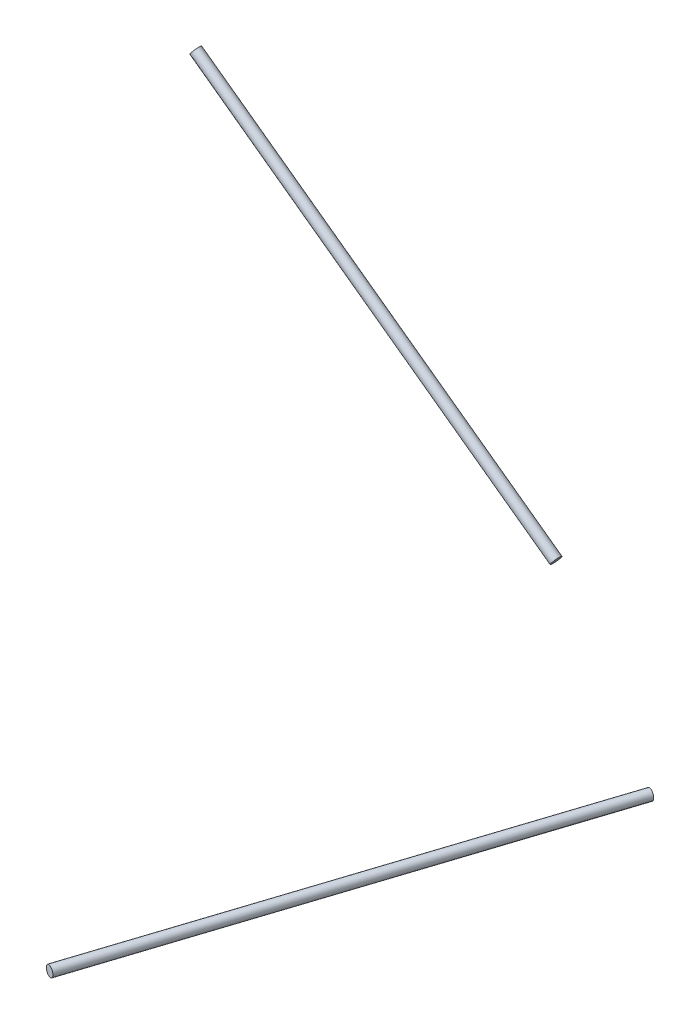
ISO-10303-21;
HEADER;
FILE_DESCRIPTION(('STEP AP214'),'2;1');
FILE_NAME('part.step','',(''),(''),'','','');
FILE_SCHEMA(('AUTOMOTIVE_DESIGN { 1 0 10303 214 1 1 1 1 }'));
ENDSEC;
DATA;
#1=APPLICATION_CONTEXT('core data for automotive mechanical design processes');
#2=APPLICATION_PROTOCOL_DEFINITION('international standard','automotive_design',2000,#1);
#3=PRODUCT_CONTEXT('',#1,'mechanical');
#4=PRODUCT('Part','Part','',(#3));
#5=PRODUCT_RELATED_PRODUCT_CATEGORY('part','',(#4));
#6=PRODUCT_DEFINITION_FORMATION('','',#4);
#7=PRODUCT_DEFINITION_CONTEXT('part definition',#1,'design');
#8=PRODUCT_DEFINITION('design','',#6,#7);
#9=PRODUCT_DEFINITION_SHAPE('','',#8);
#10=(LENGTH_UNIT() NAMED_UNIT(*) SI_UNIT(.MILLI.,.METRE.));
#11=(NAMED_UNIT(*) PLANE_ANGLE_UNIT() SI_UNIT($,.RADIAN.));
#12=(NAMED_UNIT(*) SI_UNIT($,.STERADIAN.) SOLID_ANGLE_UNIT());
#13=UNCERTAINTY_MEASURE_WITH_UNIT(LENGTH_MEASURE(1.E-05),#10,'distance_accuracy_value','');
#14=(GEOMETRIC_REPRESENTATION_CONTEXT(3) GLOBAL_UNCERTAINTY_ASSIGNED_CONTEXT((#13)) GLOBAL_UNIT_ASSIGNED_CONTEXT((#10,
#11,#12)) REPRESENTATION_CONTEXT('',''));
#15=CARTESIAN_POINT('',(0.,0.,0.));
#16=DIRECTION('',(0.,0.,1.));
#17=DIRECTION('',(1.,0.,0.));
#18=AXIS2_PLACEMENT_3D('',#15,#16,#17);
#19=CARTESIAN_POINT('',(74.3249683997209,0.,44.5903652225247));
#20=DIRECTION('',(0.309016994374937,0.,-0.951056516295157));
#21=DIRECTION('',(-0.951056516295157,0.,-0.309016994374937));
#22=AXIS2_PLACEMENT_3D('',#19,#20,#21);
#23=PLANE('',#22);
#24=CARTESIAN_POINT('',(74.3249683997209,0.,44.5903652225247));
#25=DIRECTION('',(0.309016994374937,0.,-0.951056516295157));
#26=DIRECTION('',(-0.951056516295157,0.,-0.309016994374937));
#27=AXIS2_PLACEMENT_3D('',#24,#25,#26);
#28=CIRCLE('',#27,1.49999999999999);
#29=CARTESIAN_POINT('',(72.8983836252782,0.,44.1268397309623));
#30=VERTEX_POINT('',#29);
#31=EDGE_CURVE('E47',#30,#30,#28,.T.);
#32=ORIENTED_EDGE('',*,*,#31,.F.);
#33=EDGE_LOOP('',(#32));
#34=FACE_BOUND('',#33,.T.);
#35=ADVANCED_FACE('F41',(#34),#23,.F.);
#36=CARTESIAN_POINT('',(117.688753794732,0.,-88.8696431973082));
#37=DIRECTION('',(0.309016994374937,0.,-0.951056516295157));
#38=DIRECTION('',(-0.951056516295157,0.,-0.309016994374937));
#39=AXIS2_PLACEMENT_3D('',#36,#37,#38);
#40=PLANE('',#39);
#41=CARTESIAN_POINT('',(117.688753794732,0.,-88.8696431973082));
#42=DIRECTION('',(0.309016994374937,0.,-0.951056516295157));
#43=DIRECTION('',(-0.951056516295157,0.,-0.309016994374937));
#44=AXIS2_PLACEMENT_3D('',#41,#42,#43);
#45=CIRCLE('',#44,1.49999999999999);
#46=CARTESIAN_POINT('',(116.26216902029,0.,-89.3331686888706));
#47=VERTEX_POINT('',#46);
#48=EDGE_CURVE('E11',#47,#47,#45,.T.);
#49=ORIENTED_EDGE('',*,*,#48,.T.);
#50=EDGE_LOOP('',(#49));
#51=FACE_BOUND('',#50,.T.);
#52=ADVANCED_FACE('F56',(#51),#40,.T.);
#53=CARTESIAN_POINT('',(74.3249683997209,0.,44.5903652225247));
#54=DIRECTION('',(0.309016994374937,0.,-0.951056516295157));
#55=DIRECTION('',(-0.951056516295157,0.,-0.309016994374937));
#56=AXIS2_PLACEMENT_3D('',#53,#54,#55);
#57=CYLINDRICAL_SURFACE('',#56,1.49999999999999);
#58=ORIENTED_EDGE('',*,*,#48,.F.);
#59=EDGE_LOOP('',(#58));
#60=FACE_BOUND('',#59,.T.);
#61=ORIENTED_EDGE('',*,*,#31,.T.);
#62=EDGE_LOOP('',(#61));
#63=FACE_BOUND('',#62,.T.);
#64=ADVANCED_FACE('F53',(#60,#63),#57,.T.);
#65=CLOSED_SHELL('',(#35,#52,#64));
#66=MANIFOLD_SOLID_BREP('B2',#65);
#67=CARTESIAN_POINT('',(178.792755756863,134.602822774976,0.));
#68=DIRECTION('',(-0.809016994374947,0.587785252292474,0.));
#69=DIRECTION('',(-0.587785252292474,-0.809016994374947,0.));
#70=AXIS2_PLACEMENT_3D('',#67,#68,#69);
#71=PLANE('',#70);
#72=CARTESIAN_POINT('',(178.792755756863,134.602822774976,0.));
#73=DIRECTION('',(-0.809016994374947,0.587785252292474,0.));
#74=DIRECTION('',(-0.587785252292474,-0.809016994374947,0.));
#75=AXIS2_PLACEMENT_3D('',#72,#73,#74);
#76=CIRCLE('',#75,1.5);
#77=CARTESIAN_POINT('',(177.911077878425,133.389297283414,0.));
#78=VERTEX_POINT('',#77);
#79=EDGE_CURVE('E87',#78,#78,#76,.T.);
#80=ORIENTED_EDGE('',*,*,#79,.F.);
#81=EDGE_LOOP('',(#80));
#82=FACE_BOUND('',#81,.T.);
#83=ADVANCED_FACE('F81',(#82),#71,.F.);
#84=CARTESIAN_POINT('',(72.764891711863,211.63657515724,0.));
#85=DIRECTION('',(-0.809016994374947,0.587785252292474,0.));
#86=DIRECTION('',(-0.587785252292474,-0.809016994374947,0.));
#87=AXIS2_PLACEMENT_3D('',#84,#85,#86);
#88=PLANE('',#87);
#89=CARTESIAN_POINT('',(72.764891711863,211.63657515724,0.));
#90=DIRECTION('',(-0.809016994374947,0.587785252292474,0.));
#91=DIRECTION('',(-0.587785252292474,-0.809016994374947,0.));
#92=AXIS2_PLACEMENT_3D('',#89,#90,#91);
#93=CIRCLE('',#92,1.5);
#94=CARTESIAN_POINT('',(71.8832138334243,210.423049665677,0.));
#95=VERTEX_POINT('',#94);
#96=EDGE_CURVE('E40',#95,#95,#93,.T.);
#97=ORIENTED_EDGE('',*,*,#96,.T.);
#98=EDGE_LOOP('',(#97));
#99=FACE_BOUND('',#98,.T.);
#100=ADVANCED_FACE('F96',(#99),#88,.T.);
#101=CARTESIAN_POINT('',(178.792755756863,134.602822774976,0.));
#102=DIRECTION('',(-0.809016994374948,0.587785252292473,0.));
#103=DIRECTION('',(-0.587785252292473,-0.809016994374948,0.));
#104=AXIS2_PLACEMENT_3D('',#101,#102,#103);
#105=CYLINDRICAL_SURFACE('',#104,1.5);
#106=ORIENTED_EDGE('',*,*,#96,.F.);
#107=EDGE_LOOP('',(#106));
#108=FACE_BOUND('',#107,.T.);
#109=ORIENTED_EDGE('',*,*,#79,.T.);
#110=EDGE_LOOP('',(#109));
#111=FACE_BOUND('',#110,.T.);
#112=ADVANCED_FACE('F93',(#108,#111),#105,.T.);
#113=CLOSED_SHELL('',(#83,#100,#112));
#114=MANIFOLD_SOLID_BREP('B6_NOT_SHOWN',#113);
#115=ADVANCED_BREP_SHAPE_REPRESENTATION('',(#18,#66,#114),#14);
#116=SHAPE_DEFINITION_REPRESENTATION(#9,#115);
ENDSEC;
END-ISO-10303-21;
